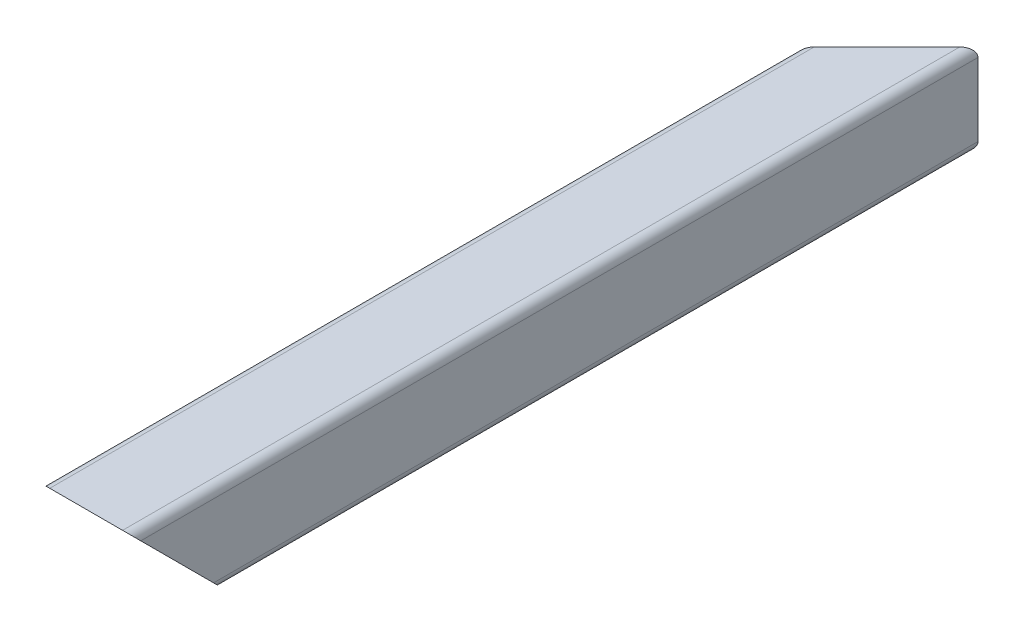
ISO-10303-21;
HEADER;
FILE_DESCRIPTION(('STEP AP214'),'2;1');
FILE_NAME('part.step','',(''),(''),'','','');
FILE_SCHEMA(('AUTOMOTIVE_DESIGN { 1 0 10303 214 1 1 1 1 }'));
ENDSEC;
DATA;
#1=APPLICATION_CONTEXT('core data for automotive mechanical design processes');
#2=APPLICATION_PROTOCOL_DEFINITION('international standard','automotive_design',2000,#1);
#3=PRODUCT_CONTEXT('',#1,'mechanical');
#4=PRODUCT('Part','Part','',(#3));
#5=PRODUCT_RELATED_PRODUCT_CATEGORY('part','',(#4));
#6=PRODUCT_DEFINITION_FORMATION('','',#4);
#7=PRODUCT_DEFINITION_CONTEXT('part definition',#1,'design');
#8=PRODUCT_DEFINITION('design','',#6,#7);
#9=PRODUCT_DEFINITION_SHAPE('','',#8);
#10=(LENGTH_UNIT() NAMED_UNIT(*) SI_UNIT(.MILLI.,.METRE.));
#11=(NAMED_UNIT(*) PLANE_ANGLE_UNIT() SI_UNIT($,.RADIAN.));
#12=(NAMED_UNIT(*) SI_UNIT($,.STERADIAN.) SOLID_ANGLE_UNIT());
#13=UNCERTAINTY_MEASURE_WITH_UNIT(LENGTH_MEASURE(1.E-05),#10,'distance_accuracy_value','');
#14=(GEOMETRIC_REPRESENTATION_CONTEXT(3) GLOBAL_UNCERTAINTY_ASSIGNED_CONTEXT((#13)) GLOBAL_UNIT_ASSIGNED_CONTEXT((#10,
#11,#12)) REPRESENTATION_CONTEXT('',''));
#15=CARTESIAN_POINT('',(0.,0.,0.));
#16=DIRECTION('',(0.,0.,1.));
#17=DIRECTION('',(1.,0.,0.));
#18=AXIS2_PLACEMENT_3D('',#15,#16,#17);
#19=CARTESIAN_POINT('',(16.,-16.,372.));
#20=DIRECTION('',(0.,0.,-1.));
#21=DIRECTION('',(-1.,0.,0.));
#22=AXIS2_PLACEMENT_3D('',#19,#20,#21);
#23=CYLINDRICAL_SURFACE('',#22,4.);
#24=CARTESIAN_POINT('',(16.,-16.,3.99999999999995));
#25=DIRECTION('',(-0.707106781186544,0.,-0.707106781186551));
#26=DIRECTION('',(0.707106781186551,0.,-0.707106781186544));
#27=AXIS2_PLACEMENT_3D('',#24,#25,#26);
#28=ELLIPSE('',#27,5.65685424949235,4.);
#29=CARTESIAN_POINT('',(20.,-16.,0.));
#30=VERTEX_POINT('',#29);
#31=CARTESIAN_POINT('',(16.,-20.,3.99999999999995));
#32=VERTEX_POINT('',#31);
#33=EDGE_CURVE('E245',#30,#32,#28,.T.);
#34=ORIENTED_EDGE('',*,*,#33,.F.);
#35=DIRECTION('',(0.,0.,-1.));
#36=VECTOR('',#35,1.);
#37=CARTESIAN_POINT('',(20.,-16.,372.));
#38=LINE('',#37,#36);
#39=CARTESIAN_POINT('',(20.,-16.,336.));
#40=VERTEX_POINT('',#39);
#41=EDGE_CURVE('E180',#40,#30,#38,.T.);
#42=ORIENTED_EDGE('',*,*,#41,.F.);
#43=CARTESIAN_POINT('',(16.,-16.,336.));
#44=DIRECTION('',(0.,-0.707106781186544,0.707106781186551));
#45=DIRECTION('',(0.,-0.707106781186551,-0.707106781186544));
#46=AXIS2_PLACEMENT_3D('',#43,#44,#45);
#47=ELLIPSE('',#46,5.65685424949235,4.);
#48=CARTESIAN_POINT('',(16.,-20.,332.));
#49=VERTEX_POINT('',#48);
#50=EDGE_CURVE('E201',#49,#40,#47,.T.);
#51=ORIENTED_EDGE('',*,*,#50,.F.);
#52=DIRECTION('',(0.,0.,-1.));
#53=VECTOR('',#52,1.);
#54=CARTESIAN_POINT('',(16.,-20.,372.));
#55=LINE('',#54,#53);
#56=EDGE_CURVE('E228',#49,#32,#55,.T.);
#57=ORIENTED_EDGE('',*,*,#56,.T.);
#58=EDGE_LOOP('',(#34,#42,#51,#57));
#59=FACE_BOUND('',#58,.T.);
#60=ADVANCED_FACE('F36',(#59),#23,.T.);
#61=CARTESIAN_POINT('',(16.,16.,372.));
#62=DIRECTION('',(0.,0.,-1.));
#63=DIRECTION('',(-1.,0.,0.));
#64=AXIS2_PLACEMENT_3D('',#61,#62,#63);
#65=CYLINDRICAL_SURFACE('',#64,4.);
#66=CARTESIAN_POINT('',(16.,16.,3.99999999999995));
#67=DIRECTION('',(-0.707106781186544,0.,-0.707106781186551));
#68=DIRECTION('',(0.707106781186551,0.,-0.707106781186544));
#69=AXIS2_PLACEMENT_3D('',#66,#67,#68);
#70=ELLIPSE('',#69,5.65685424949235,4.);
#71=CARTESIAN_POINT('',(16.,20.,3.99999999999989));
#72=VERTEX_POINT('',#71);
#73=CARTESIAN_POINT('',(20.,16.,0.));
#74=VERTEX_POINT('',#73);
#75=EDGE_CURVE('E162',#72,#74,#70,.T.);
#76=ORIENTED_EDGE('',*,*,#75,.F.);
#77=DIRECTION('',(0.,0.,-1.));
#78=VECTOR('',#77,1.);
#79=CARTESIAN_POINT('',(16.,20.,372.));
#80=LINE('',#79,#78);
#81=CARTESIAN_POINT('',(16.,20.,372.));
#82=VERTEX_POINT('',#81);
#83=EDGE_CURVE('E169',#82,#72,#80,.T.);
#84=ORIENTED_EDGE('',*,*,#83,.F.);
#85=CARTESIAN_POINT('',(16.,16.,368.));
#86=DIRECTION('',(0.,-0.707106781186544,0.707106781186551));
#87=DIRECTION('',(0.,-0.707106781186551,-0.707106781186544));
#88=AXIS2_PLACEMENT_3D('',#85,#86,#87);
#89=ELLIPSE('',#88,5.65685424949235,4.);
#90=CARTESIAN_POINT('',(20.,16.,368.));
#91=VERTEX_POINT('',#90);
#92=EDGE_CURVE('E274',#91,#82,#89,.T.);
#93=ORIENTED_EDGE('',*,*,#92,.F.);
#94=DIRECTION('',(0.,0.,-1.));
#95=VECTOR('',#94,1.);
#96=CARTESIAN_POINT('',(20.,16.,372.));
#97=LINE('',#96,#95);
#98=EDGE_CURVE('E177',#91,#74,#97,.T.);
#99=ORIENTED_EDGE('',*,*,#98,.T.);
#100=EDGE_LOOP('',(#76,#84,#93,#99));
#101=FACE_BOUND('',#100,.T.);
#102=ADVANCED_FACE('F286',(#101),#65,.T.);
#103=CARTESIAN_POINT('',(-16.,16.,372.));
#104=DIRECTION('',(0.,0.,-1.));
#105=DIRECTION('',(-1.,0.,0.));
#106=AXIS2_PLACEMENT_3D('',#103,#104,#105);
#107=CYLINDRICAL_SURFACE('',#106,4.);
#108=CARTESIAN_POINT('',(-16.,16.,35.9999999999996));
#109=DIRECTION('',(-0.707106781186544,0.,-0.707106781186551));
#110=DIRECTION('',(0.707106781186551,0.,-0.707106781186544));
#111=AXIS2_PLACEMENT_3D('',#108,#109,#110);
#112=ELLIPSE('',#111,5.65685424949235,4.);
#113=CARTESIAN_POINT('',(-20.,16.,39.9999999999996));
#114=VERTEX_POINT('',#113);
#115=CARTESIAN_POINT('',(-16.,20.,35.9999999999996));
#116=VERTEX_POINT('',#115);
#117=EDGE_CURVE('E57',#114,#116,#112,.T.);
#118=ORIENTED_EDGE('',*,*,#117,.F.);
#119=DIRECTION('',(0.,0.,-1.));
#120=VECTOR('',#119,1.);
#121=CARTESIAN_POINT('',(-20.,16.,372.));
#122=LINE('',#121,#120);
#123=CARTESIAN_POINT('',(-20.,16.,368.));
#124=VERTEX_POINT('',#123);
#125=EDGE_CURVE('E159',#124,#114,#122,.T.);
#126=ORIENTED_EDGE('',*,*,#125,.F.);
#127=CARTESIAN_POINT('',(-16.,16.,368.));
#128=DIRECTION('',(0.,-0.707106781186544,0.707106781186551));
#129=DIRECTION('',(0.,-0.707106781186551,-0.707106781186544));
#130=AXIS2_PLACEMENT_3D('',#127,#128,#129);
#131=ELLIPSE('',#130,5.65685424949236,4.);
#132=CARTESIAN_POINT('',(-16.,20.,372.));
#133=VERTEX_POINT('',#132);
#134=EDGE_CURVE('E272',#133,#124,#131,.T.);
#135=ORIENTED_EDGE('',*,*,#134,.F.);
#136=DIRECTION('',(0.,0.,-1.));
#137=VECTOR('',#136,1.);
#138=CARTESIAN_POINT('',(-16.,20.,372.));
#139=LINE('',#138,#137);
#140=EDGE_CURVE('E161',#133,#116,#139,.T.);
#141=ORIENTED_EDGE('',*,*,#140,.T.);
#142=EDGE_LOOP('',(#118,#126,#135,#141));
#143=FACE_BOUND('',#142,.T.);
#144=ADVANCED_FACE('F157',(#143),#107,.T.);
#145=CARTESIAN_POINT('',(-20.,16.,372.));
#146=DIRECTION('',(1.,0.,0.));
#147=DIRECTION('',(0.,1.,0.));
#148=AXIS2_PLACEMENT_3D('',#145,#146,#147);
#149=PLANE('',#148);
#150=DIRECTION('',(0.,-1.,0.));
#151=VECTOR('',#150,1.);
#152=CARTESIAN_POINT('',(-20.,72.,39.9999999999996));
#153=LINE('',#152,#151);
#154=CARTESIAN_POINT('',(-20.,-16.,39.9999999999996));
#155=VERTEX_POINT('',#154);
#156=EDGE_CURVE('E145',#114,#155,#153,.T.);
#157=ORIENTED_EDGE('',*,*,#156,.T.);
#158=DIRECTION('',(0.,0.,-1.));
#159=VECTOR('',#158,1.);
#160=CARTESIAN_POINT('',(-20.,-16.,372.));
#161=LINE('',#160,#159);
#162=CARTESIAN_POINT('',(-20.,-16.,336.));
#163=VERTEX_POINT('',#162);
#164=EDGE_CURVE('E167',#163,#155,#161,.T.);
#165=ORIENTED_EDGE('',*,*,#164,.F.);
#166=DIRECTION('',(0.,-0.707106781186551,-0.707106781186544));
#167=VECTOR('',#166,1.);
#168=CARTESIAN_POINT('',(-20.,18.,370.));
#169=LINE('',#168,#167);
#170=EDGE_CURVE('E166',#124,#163,#169,.T.);
#171=ORIENTED_EDGE('',*,*,#170,.F.);
#172=ORIENTED_EDGE('',*,*,#125,.T.);
#173=EDGE_LOOP('',(#157,#165,#171,#172));
#174=FACE_BOUND('',#173,.T.);
#175=ADVANCED_FACE('F165',(#174),#149,.F.);
#176=CARTESIAN_POINT('',(-16.,-16.,372.));
#177=DIRECTION('',(0.,0.,-1.));
#178=DIRECTION('',(-1.,0.,0.));
#179=AXIS2_PLACEMENT_3D('',#176,#177,#178);
#180=CYLINDRICAL_SURFACE('',#179,4.);
#181=CARTESIAN_POINT('',(-16.,-16.,35.9999999999996));
#182=DIRECTION('',(-0.707106781186544,0.,-0.707106781186551));
#183=DIRECTION('',(0.707106781186551,0.,-0.707106781186544));
#184=AXIS2_PLACEMENT_3D('',#181,#182,#183);
#185=ELLIPSE('',#184,5.65685424949236,4.);
#186=CARTESIAN_POINT('',(-16.,-20.,35.9999999999996));
#187=VERTEX_POINT('',#186);
#188=EDGE_CURVE('E148',#187,#155,#185,.T.);
#189=ORIENTED_EDGE('',*,*,#188,.F.);
#190=DIRECTION('',(0.,0.,-1.));
#191=VECTOR('',#190,1.);
#192=CARTESIAN_POINT('',(-16.,-20.,372.));
#193=LINE('',#192,#191);
#194=CARTESIAN_POINT('',(-16.,-20.,332.));
#195=VERTEX_POINT('',#194);
#196=EDGE_CURVE('E171',#195,#187,#193,.T.);
#197=ORIENTED_EDGE('',*,*,#196,.F.);
#198=CARTESIAN_POINT('',(-16.,-16.,336.));
#199=DIRECTION('',(0.,-0.707106781186544,0.707106781186551));
#200=DIRECTION('',(0.,-0.707106781186551,-0.707106781186544));
#201=AXIS2_PLACEMENT_3D('',#198,#199,#200);
#202=ELLIPSE('',#201,5.65685424949236,4.);
#203=EDGE_CURVE('E244',#163,#195,#202,.T.);
#204=ORIENTED_EDGE('',*,*,#203,.F.);
#205=ORIENTED_EDGE('',*,*,#164,.T.);
#206=EDGE_LOOP('',(#189,#197,#204,#205));
#207=FACE_BOUND('',#206,.T.);
#208=ADVANCED_FACE('F243',(#207),#180,.T.);
#209=CARTESIAN_POINT('',(-16.,-20.,372.));
#210=DIRECTION('',(0.,1.,0.));
#211=DIRECTION('',(0.,0.,1.));
#212=AXIS2_PLACEMENT_3D('',#209,#210,#211);
#213=PLANE('',#212);
#214=DIRECTION('',(-0.707106781186551,0.,0.707106781186544));
#215=VECTOR('',#214,1.);
#216=CARTESIAN_POINT('',(-184.,-20.,203.999999999998));
#217=LINE('',#216,#215);
#218=EDGE_CURVE('E239',#32,#187,#217,.T.);
#219=ORIENTED_EDGE('',*,*,#218,.F.);
#220=ORIENTED_EDGE('',*,*,#56,.F.);
#221=DIRECTION('',(-1.,0.,0.));
#222=VECTOR('',#221,1.);
#223=CARTESIAN_POINT('',(41.,-20.,332.));
#224=LINE('',#223,#222);
#225=EDGE_CURVE('E240',#49,#195,#224,.T.);
#226=ORIENTED_EDGE('',*,*,#225,.T.);
#227=ORIENTED_EDGE('',*,*,#196,.T.);
#228=EDGE_LOOP('',(#219,#220,#226,#227));
#229=FACE_BOUND('',#228,.T.);
#230=ADVANCED_FACE('F237',(#229),#213,.F.);
#231=CARTESIAN_POINT('',(-16.,16.,372.));
#232=DIRECTION('',(0.,0.,-1.));
#233=DIRECTION('',(-1.,0.,0.));
#234=AXIS2_PLACEMENT_3D('',#231,#232,#233);
#235=CYLINDRICAL_SURFACE('',#234,2.);
#236=DIRECTION('',(0.,0.,-1.));
#237=VECTOR('',#236,1.);
#238=CARTESIAN_POINT('',(-18.,16.,372.));
#239=LINE('',#238,#237);
#240=CARTESIAN_POINT('',(-18.,16.,368.));
#241=VERTEX_POINT('',#240);
#242=CARTESIAN_POINT('',(-18.,16.,37.9999999999996));
#243=VERTEX_POINT('',#242);
#244=EDGE_CURVE('E223',#241,#243,#239,.T.);
#245=ORIENTED_EDGE('',*,*,#244,.T.);
#246=CARTESIAN_POINT('',(-16.,16.,35.9999999999996));
#247=DIRECTION('',(-0.707106781186544,0.,-0.707106781186551));
#248=DIRECTION('',(0.707106781186551,0.,-0.707106781186544));
#249=AXIS2_PLACEMENT_3D('',#246,#247,#248);
#250=ELLIPSE('',#249,2.82842712474617,2.);
#251=CARTESIAN_POINT('',(-16.,18.,35.9999999999996));
#252=VERTEX_POINT('',#251);
#253=EDGE_CURVE('E200',#243,#252,#250,.T.);
#254=ORIENTED_EDGE('',*,*,#253,.T.);
#255=DIRECTION('',(0.,0.,-1.));
#256=VECTOR('',#255,1.);
#257=CARTESIAN_POINT('',(-16.,18.,372.));
#258=LINE('',#257,#256);
#259=CARTESIAN_POINT('',(-16.,18.,370.));
#260=VERTEX_POINT('',#259);
#261=EDGE_CURVE('E188',#260,#252,#258,.T.);
#262=ORIENTED_EDGE('',*,*,#261,.F.);
#263=CARTESIAN_POINT('',(-16.,16.,368.));
#264=DIRECTION('',(0.,-0.707106781186544,0.707106781186551));
#265=DIRECTION('',(0.,-0.707106781186551,-0.707106781186544));
#266=AXIS2_PLACEMENT_3D('',#263,#264,#265);
#267=ELLIPSE('',#266,2.82842712474617,2.);
#268=EDGE_CURVE('E198',#260,#241,#267,.T.);
#269=ORIENTED_EDGE('',*,*,#268,.T.);
#270=EDGE_LOOP('',(#245,#254,#262,#269));
#271=FACE_BOUND('',#270,.T.);
#272=ADVANCED_FACE('F197',(#271),#235,.F.);
#273=CARTESIAN_POINT('',(-18.,16.,372.));
#274=DIRECTION('',(1.,0.,0.));
#275=DIRECTION('',(0.,1.,0.));
#276=AXIS2_PLACEMENT_3D('',#273,#274,#275);
#277=PLANE('',#276);
#278=DIRECTION('',(0.,0.,-1.));
#279=VECTOR('',#278,1.);
#280=CARTESIAN_POINT('',(-18.,-16.,372.));
#281=LINE('',#280,#279);
#282=CARTESIAN_POINT('',(-18.,-16.,336.));
#283=VERTEX_POINT('',#282);
#284=CARTESIAN_POINT('',(-18.,-16.,37.9999999999996));
#285=VERTEX_POINT('',#284);
#286=EDGE_CURVE('E220',#283,#285,#281,.T.);
#287=ORIENTED_EDGE('',*,*,#286,.T.);
#288=DIRECTION('',(0.,1.,0.));
#289=VECTOR('',#288,1.);
#290=CARTESIAN_POINT('',(-18.,16.0000000000001,37.9999999999996));
#291=LINE('',#290,#289);
#292=EDGE_CURVE('E331',#285,#243,#291,.T.);
#293=ORIENTED_EDGE('',*,*,#292,.T.);
#294=ORIENTED_EDGE('',*,*,#244,.F.);
#295=DIRECTION('',(0.,-0.707106781186551,-0.707106781186544));
#296=VECTOR('',#295,1.);
#297=CARTESIAN_POINT('',(-18.,18.,370.));
#298=LINE('',#297,#296);
#299=EDGE_CURVE('E266',#241,#283,#298,.T.);
#300=ORIENTED_EDGE('',*,*,#299,.T.);
#301=EDGE_LOOP('',(#287,#293,#294,#300));
#302=FACE_BOUND('',#301,.T.);
#303=ADVANCED_FACE('F334',(#302),#277,.T.);
#304=CARTESIAN_POINT('',(-16.,-16.,372.));
#305=DIRECTION('',(0.,0.,-1.));
#306=DIRECTION('',(-1.,0.,0.));
#307=AXIS2_PLACEMENT_3D('',#304,#305,#306);
#308=CYLINDRICAL_SURFACE('',#307,2.);
#309=DIRECTION('',(0.,0.,-1.));
#310=VECTOR('',#309,1.);
#311=CARTESIAN_POINT('',(-16.,-18.,372.));
#312=LINE('',#311,#310);
#313=CARTESIAN_POINT('',(-16.,-18.,334.));
#314=VERTEX_POINT('',#313);
#315=CARTESIAN_POINT('',(-16.,-18.,35.9999999999996));
#316=VERTEX_POINT('',#315);
#317=EDGE_CURVE('E217',#314,#316,#312,.T.);
#318=ORIENTED_EDGE('',*,*,#317,.T.);
#319=CARTESIAN_POINT('',(-16.,-16.,35.9999999999996));
#320=DIRECTION('',(-0.707106781186544,0.,-0.707106781186551));
#321=DIRECTION('',(0.707106781186551,0.,-0.707106781186544));
#322=AXIS2_PLACEMENT_3D('',#319,#320,#321);
#323=ELLIPSE('',#322,2.82842712474618,2.);
#324=EDGE_CURVE('E328',#316,#285,#323,.T.);
#325=ORIENTED_EDGE('',*,*,#324,.T.);
#326=ORIENTED_EDGE('',*,*,#286,.F.);
#327=CARTESIAN_POINT('',(-16.,-16.,336.));
#328=DIRECTION('',(0.,-0.707106781186544,0.707106781186551));
#329=DIRECTION('',(0.,-0.707106781186551,-0.707106781186544));
#330=AXIS2_PLACEMENT_3D('',#327,#328,#329);
#331=ELLIPSE('',#330,2.82842712474618,2.);
#332=EDGE_CURVE('E263',#283,#314,#331,.T.);
#333=ORIENTED_EDGE('',*,*,#332,.T.);
#334=EDGE_LOOP('',(#318,#325,#326,#333));
#335=FACE_BOUND('',#334,.T.);
#336=ADVANCED_FACE('F337',(#335),#308,.F.);
#337=CARTESIAN_POINT('',(-16.,-18.,372.));
#338=DIRECTION('',(0.,1.,0.));
#339=DIRECTION('',(0.,0.,1.));
#340=AXIS2_PLACEMENT_3D('',#337,#338,#339);
#341=PLANE('',#340);
#342=DIRECTION('',(0.,0.,-1.));
#343=VECTOR('',#342,1.);
#344=CARTESIAN_POINT('',(16.,-18.,372.));
#345=LINE('',#344,#343);
#346=CARTESIAN_POINT('',(16.,-18.,334.));
#347=VERTEX_POINT('',#346);
#348=CARTESIAN_POINT('',(16.,-18.,3.99999999999995));
#349=VERTEX_POINT('',#348);
#350=EDGE_CURVE('E214',#347,#349,#345,.T.);
#351=ORIENTED_EDGE('',*,*,#350,.T.);
#352=DIRECTION('',(-0.707106781186551,0.,0.707106781186544));
#353=VECTOR('',#352,1.);
#354=CARTESIAN_POINT('',(-184.,-18.,203.999999999998));
#355=LINE('',#354,#353);
#356=EDGE_CURVE('E325',#349,#316,#355,.T.);
#357=ORIENTED_EDGE('',*,*,#356,.T.);
#358=ORIENTED_EDGE('',*,*,#317,.F.);
#359=DIRECTION('',(1.,0.,0.));
#360=VECTOR('',#359,1.);
#361=CARTESIAN_POINT('',(-16.,-18.,334.));
#362=LINE('',#361,#360);
#363=EDGE_CURVE('E260',#314,#347,#362,.T.);
#364=ORIENTED_EDGE('',*,*,#363,.T.);
#365=EDGE_LOOP('',(#351,#357,#358,#364));
#366=FACE_BOUND('',#365,.T.);
#367=ADVANCED_FACE('F340',(#366),#341,.T.);
#368=CARTESIAN_POINT('',(16.,-16.,372.));
#369=DIRECTION('',(0.,0.,-1.));
#370=DIRECTION('',(-1.,0.,0.));
#371=AXIS2_PLACEMENT_3D('',#368,#369,#370);
#372=CYLINDRICAL_SURFACE('',#371,2.);
#373=DIRECTION('',(0.,0.,-1.));
#374=VECTOR('',#373,1.);
#375=CARTESIAN_POINT('',(18.,-16.,372.));
#376=LINE('',#375,#374);
#377=CARTESIAN_POINT('',(18.,-16.,336.));
#378=VERTEX_POINT('',#377);
#379=CARTESIAN_POINT('',(18.,-16.,1.99999999999995));
#380=VERTEX_POINT('',#379);
#381=EDGE_CURVE('E211',#378,#380,#376,.T.);
#382=ORIENTED_EDGE('',*,*,#381,.T.);
#383=CARTESIAN_POINT('',(16.,-16.,3.99999999999995));
#384=DIRECTION('',(-0.707106781186544,0.,-0.707106781186551));
#385=DIRECTION('',(0.707106781186551,0.,-0.707106781186544));
#386=AXIS2_PLACEMENT_3D('',#383,#384,#385);
#387=ELLIPSE('',#386,2.82842712474618,2.);
#388=EDGE_CURVE('E322',#380,#349,#387,.T.);
#389=ORIENTED_EDGE('',*,*,#388,.T.);
#390=ORIENTED_EDGE('',*,*,#350,.F.);
#391=CARTESIAN_POINT('',(16.,-16.,336.));
#392=DIRECTION('',(0.,-0.707106781186544,0.707106781186551));
#393=DIRECTION('',(0.,-0.707106781186551,-0.707106781186544));
#394=AXIS2_PLACEMENT_3D('',#391,#392,#393);
#395=ELLIPSE('',#394,2.82842712474618,2.);
#396=EDGE_CURVE('E257',#347,#378,#395,.T.);
#397=ORIENTED_EDGE('',*,*,#396,.T.);
#398=EDGE_LOOP('',(#382,#389,#390,#397));
#399=FACE_BOUND('',#398,.T.);
#400=ADVANCED_FACE('F343',(#399),#372,.F.);
#401=CARTESIAN_POINT('',(18.,16.,372.));
#402=DIRECTION('',(-1.,0.,0.));
#403=DIRECTION('',(0.,0.,1.));
#404=AXIS2_PLACEMENT_3D('',#401,#402,#403);
#405=PLANE('',#404);
#406=DIRECTION('',(0.,0.,-1.));
#407=VECTOR('',#406,1.);
#408=CARTESIAN_POINT('',(18.,16.,372.));
#409=LINE('',#408,#407);
#410=CARTESIAN_POINT('',(18.,16.,368.));
#411=VERTEX_POINT('',#410);
#412=CARTESIAN_POINT('',(18.,16.,1.99999999999995));
#413=VERTEX_POINT('',#412);
#414=EDGE_CURVE('E203',#411,#413,#409,.T.);
#415=ORIENTED_EDGE('',*,*,#414,.T.);
#416=DIRECTION('',(0.,-1.,0.));
#417=VECTOR('',#416,1.);
#418=CARTESIAN_POINT('',(18.,16.,1.99999999999995));
#419=LINE('',#418,#417);
#420=EDGE_CURVE('E319',#413,#380,#419,.T.);
#421=ORIENTED_EDGE('',*,*,#420,.T.);
#422=ORIENTED_EDGE('',*,*,#381,.F.);
#423=DIRECTION('',(0.,0.707106781186551,0.707106781186544));
#424=VECTOR('',#423,1.);
#425=CARTESIAN_POINT('',(18.,18.,370.));
#426=LINE('',#425,#424);
#427=EDGE_CURVE('E254',#378,#411,#426,.T.);
#428=ORIENTED_EDGE('',*,*,#427,.T.);
#429=EDGE_LOOP('',(#415,#421,#422,#428));
#430=FACE_BOUND('',#429,.T.);
#431=ADVANCED_FACE('F346',(#430),#405,.T.);
#432=CARTESIAN_POINT('',(16.,16.,372.));
#433=DIRECTION('',(0.,0.,-1.));
#434=DIRECTION('',(-1.,0.,0.));
#435=AXIS2_PLACEMENT_3D('',#432,#433,#434);
#436=CYLINDRICAL_SURFACE('',#435,2.);
#437=DIRECTION('',(0.,0.,-1.));
#438=VECTOR('',#437,1.);
#439=CARTESIAN_POINT('',(16.,18.,372.));
#440=LINE('',#439,#438);
#441=CARTESIAN_POINT('',(16.,18.,370.));
#442=VERTEX_POINT('',#441);
#443=CARTESIAN_POINT('',(16.,18.,3.99999999999988));
#444=VERTEX_POINT('',#443);
#445=EDGE_CURVE('E190',#442,#444,#440,.T.);
#446=ORIENTED_EDGE('',*,*,#445,.T.);
#447=CARTESIAN_POINT('',(16.,16.,3.99999999999995));
#448=DIRECTION('',(-0.707106781186544,0.,-0.707106781186551));
#449=DIRECTION('',(0.707106781186551,0.,-0.707106781186544));
#450=AXIS2_PLACEMENT_3D('',#447,#448,#449);
#451=ELLIPSE('',#450,2.82842712474618,2.);
#452=EDGE_CURVE('E50',#444,#413,#451,.T.);
#453=ORIENTED_EDGE('',*,*,#452,.T.);
#454=ORIENTED_EDGE('',*,*,#414,.F.);
#455=CARTESIAN_POINT('',(16.,16.,368.));
#456=DIRECTION('',(0.,-0.707106781186544,0.707106781186551));
#457=DIRECTION('',(0.,-0.707106781186551,-0.707106781186544));
#458=AXIS2_PLACEMENT_3D('',#455,#456,#457);
#459=ELLIPSE('',#458,2.82842712474618,2.);
#460=EDGE_CURVE('E252',#411,#442,#459,.T.);
#461=ORIENTED_EDGE('',*,*,#460,.T.);
#462=EDGE_LOOP('',(#446,#453,#454,#461));
#463=FACE_BOUND('',#462,.T.);
#464=ADVANCED_FACE('F312',(#463),#436,.F.);
#465=CARTESIAN_POINT('',(-16.,18.,372.));
#466=DIRECTION('',(0.,-1.,0.));
#467=DIRECTION('',(0.,0.,-1.));
#468=AXIS2_PLACEMENT_3D('',#465,#466,#467);
#469=PLANE('',#468);
#470=ORIENTED_EDGE('',*,*,#261,.T.);
#471=DIRECTION('',(0.707106781186551,0.,-0.707106781186544));
#472=VECTOR('',#471,1.);
#473=CARTESIAN_POINT('',(-184.,18.,203.999999999998));
#474=LINE('',#473,#472);
#475=EDGE_CURVE('E314',#252,#444,#474,.T.);
#476=ORIENTED_EDGE('',*,*,#475,.T.);
#477=ORIENTED_EDGE('',*,*,#445,.F.);
#478=DIRECTION('',(-1.,0.,0.));
#479=VECTOR('',#478,1.);
#480=CARTESIAN_POINT('',(-16.,18.,370.));
#481=LINE('',#480,#479);
#482=EDGE_CURVE('E43',#442,#260,#481,.T.);
#483=ORIENTED_EDGE('',*,*,#482,.T.);
#484=EDGE_LOOP('',(#470,#476,#477,#483));
#485=FACE_BOUND('',#484,.T.);
#486=ADVANCED_FACE('F187',(#485),#469,.T.);
#487=CARTESIAN_POINT('',(-16.,20.,372.));
#488=DIRECTION('',(0.,-1.,0.));
#489=DIRECTION('',(0.,0.,-1.));
#490=AXIS2_PLACEMENT_3D('',#487,#488,#489);
#491=PLANE('',#490);
#492=DIRECTION('',(0.707106781186551,0.,-0.707106781186544));
#493=VECTOR('',#492,1.);
#494=CARTESIAN_POINT('',(-184.,20.,203.999999999998));
#495=LINE('',#494,#493);
#496=EDGE_CURVE('E11',#116,#72,#495,.T.);
#497=ORIENTED_EDGE('',*,*,#496,.F.);
#498=ORIENTED_EDGE('',*,*,#140,.F.);
#499=DIRECTION('',(-1.,0.,0.));
#500=VECTOR('',#499,1.);
#501=CARTESIAN_POINT('',(-16.,20.,372.));
#502=LINE('',#501,#500);
#503=EDGE_CURVE('E226',#82,#133,#502,.T.);
#504=ORIENTED_EDGE('',*,*,#503,.F.);
#505=ORIENTED_EDGE('',*,*,#83,.T.);
#506=EDGE_LOOP('',(#497,#498,#504,#505));
#507=FACE_BOUND('',#506,.T.);
#508=ADVANCED_FACE('F301',(#507),#491,.F.);
#509=CARTESIAN_POINT('',(20.,16.,372.));
#510=DIRECTION('',(-1.,0.,0.));
#511=DIRECTION('',(0.,-1.,0.));
#512=AXIS2_PLACEMENT_3D('',#509,#510,#511);
#513=PLANE('',#512);
#514=DIRECTION('',(0.,0.707106781186551,0.707106781186544));
#515=VECTOR('',#514,1.);
#516=CARTESIAN_POINT('',(20.,18.,370.));
#517=LINE('',#516,#515);
#518=EDGE_CURVE('E205',#40,#91,#517,.T.);
#519=ORIENTED_EDGE('',*,*,#518,.F.);
#520=ORIENTED_EDGE('',*,*,#41,.T.);
#521=DIRECTION('',(0.,1.,0.));
#522=VECTOR('',#521,1.);
#523=CARTESIAN_POINT('',(20.,16.,0.));
#524=LINE('',#523,#522);
#525=EDGE_CURVE('E225',#30,#74,#524,.T.);
#526=ORIENTED_EDGE('',*,*,#525,.T.);
#527=ORIENTED_EDGE('',*,*,#98,.F.);
#528=EDGE_LOOP('',(#519,#520,#526,#527));
#529=FACE_BOUND('',#528,.T.);
#530=ADVANCED_FACE('F288',(#529),#513,.F.);
#531=CARTESIAN_POINT('',(41.,20.,372.));
#532=DIRECTION('',(0.,-0.707106781186544,0.707106781186551));
#533=DIRECTION('',(0.,-0.707106781186551,-0.707106781186544));
#534=AXIS2_PLACEMENT_3D('',#531,#532,#533);
#535=PLANE('',#534);
#536=ORIENTED_EDGE('',*,*,#482,.F.);
#537=ORIENTED_EDGE('',*,*,#460,.F.);
#538=ORIENTED_EDGE('',*,*,#427,.F.);
#539=ORIENTED_EDGE('',*,*,#396,.F.);
#540=ORIENTED_EDGE('',*,*,#363,.F.);
#541=ORIENTED_EDGE('',*,*,#332,.F.);
#542=ORIENTED_EDGE('',*,*,#299,.F.);
#543=ORIENTED_EDGE('',*,*,#268,.F.);
#544=EDGE_LOOP('',(#536,#537,#538,#539,#540,#541,#542,#543));
#545=FACE_BOUND('',#544,.T.);
#546=ORIENTED_EDGE('',*,*,#50,.T.);
#547=ORIENTED_EDGE('',*,*,#518,.T.);
#548=ORIENTED_EDGE('',*,*,#92,.T.);
#549=ORIENTED_EDGE('',*,*,#503,.T.);
#550=ORIENTED_EDGE('',*,*,#134,.T.);
#551=ORIENTED_EDGE('',*,*,#170,.T.);
#552=ORIENTED_EDGE('',*,*,#203,.T.);
#553=ORIENTED_EDGE('',*,*,#225,.F.);
#554=EDGE_LOOP('',(#546,#547,#548,#549,#550,#551,#552,#553));
#555=FACE_BOUND('',#554,.T.);
#556=ADVANCED_FACE('F278',(#545,#555),#535,.T.);
#557=CARTESIAN_POINT('',(20.,72.,0.));
#558=DIRECTION('',(-0.707106781186544,0.,-0.707106781186551));
#559=DIRECTION('',(-0.707106781186551,0.,0.707106781186544));
#560=AXIS2_PLACEMENT_3D('',#557,#558,#559);
#561=PLANE('',#560);
#562=ORIENTED_EDGE('',*,*,#292,.F.);
#563=ORIENTED_EDGE('',*,*,#324,.F.);
#564=ORIENTED_EDGE('',*,*,#356,.F.);
#565=ORIENTED_EDGE('',*,*,#388,.F.);
#566=ORIENTED_EDGE('',*,*,#420,.F.);
#567=ORIENTED_EDGE('',*,*,#452,.F.);
#568=ORIENTED_EDGE('',*,*,#475,.F.);
#569=ORIENTED_EDGE('',*,*,#253,.F.);
#570=EDGE_LOOP('',(#562,#563,#564,#565,#566,#567,#568,#569));
#571=FACE_BOUND('',#570,.T.);
#572=ORIENTED_EDGE('',*,*,#33,.T.);
#573=ORIENTED_EDGE('',*,*,#218,.T.);
#574=ORIENTED_EDGE('',*,*,#188,.T.);
#575=ORIENTED_EDGE('',*,*,#156,.F.);
#576=ORIENTED_EDGE('',*,*,#117,.T.);
#577=ORIENTED_EDGE('',*,*,#496,.T.);
#578=ORIENTED_EDGE('',*,*,#75,.T.);
#579=ORIENTED_EDGE('',*,*,#525,.F.);
#580=EDGE_LOOP('',(#572,#573,#574,#575,#576,#577,#578,#579));
#581=FACE_BOUND('',#580,.T.);
#582=ADVANCED_FACE('F146',(#571,#581),#561,.T.);
#583=CLOSED_SHELL('',(#60,#102,#144,#175,#208,#230,#272,#303,#336,#367,#400,#431,#464,#486,#508,
#530,#556,#582));
#584=MANIFOLD_SOLID_BREP('B2',#583);
#585=ADVANCED_BREP_SHAPE_REPRESENTATION('',(#18,#584),#14);
#586=SHAPE_DEFINITION_REPRESENTATION(#9,#585);
ENDSEC;
END-ISO-10303-21;
